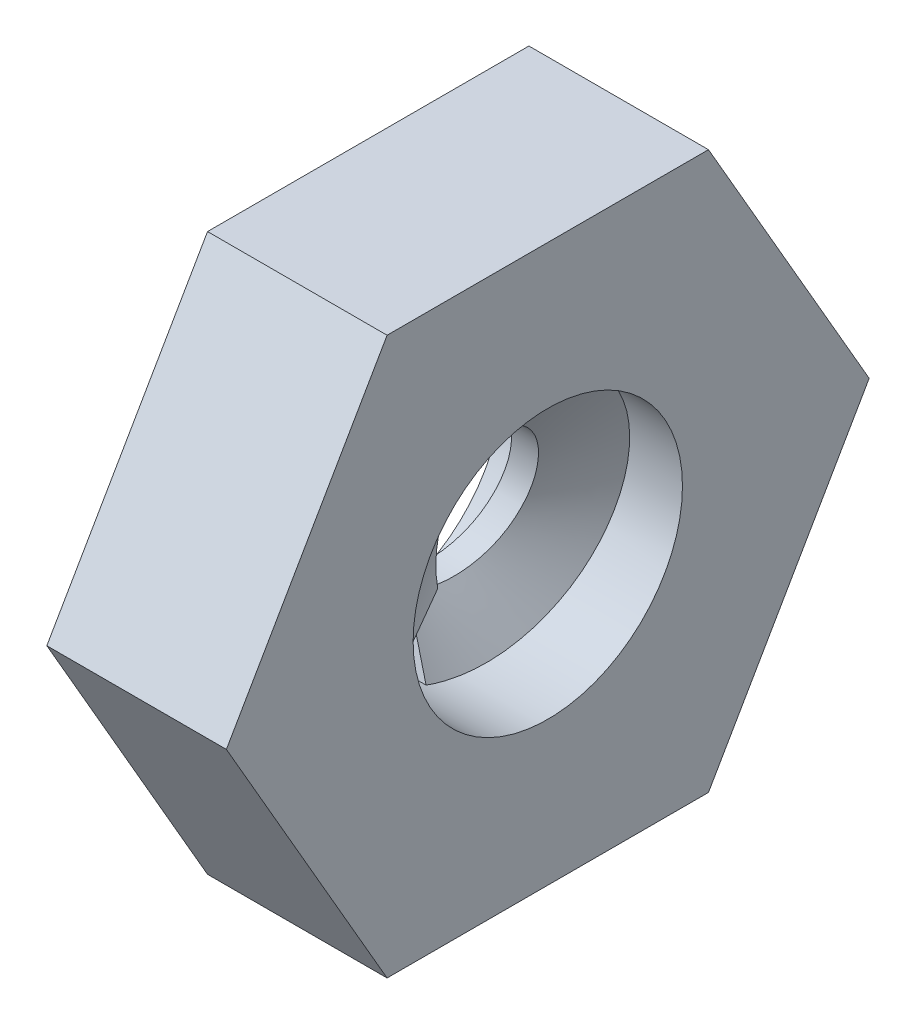
ISO-10303-21;
HEADER;
FILE_DESCRIPTION(('STEP AP214'),'2;1');
FILE_NAME('part.step','',(''),(''),'','','');
FILE_SCHEMA(('AUTOMOTIVE_DESIGN { 1 0 10303 214 1 1 1 1 }'));
ENDSEC;
DATA;
#1=APPLICATION_CONTEXT('core data for automotive mechanical design processes');
#2=APPLICATION_PROTOCOL_DEFINITION('international standard','automotive_design',2000,#1);
#3=PRODUCT_CONTEXT('',#1,'mechanical');
#4=PRODUCT('Part','Part','',(#3));
#5=PRODUCT_RELATED_PRODUCT_CATEGORY('part','',(#4));
#6=PRODUCT_DEFINITION_FORMATION('','',#4);
#7=PRODUCT_DEFINITION_CONTEXT('part definition',#1,'design');
#8=PRODUCT_DEFINITION('design','',#6,#7);
#9=PRODUCT_DEFINITION_SHAPE('','',#8);
#10=(LENGTH_UNIT() NAMED_UNIT(*) SI_UNIT(.MILLI.,.METRE.));
#11=(NAMED_UNIT(*) PLANE_ANGLE_UNIT() SI_UNIT($,.RADIAN.));
#12=(NAMED_UNIT(*) SI_UNIT($,.STERADIAN.) SOLID_ANGLE_UNIT());
#13=UNCERTAINTY_MEASURE_WITH_UNIT(LENGTH_MEASURE(1.E-05),#10,'distance_accuracy_value','');
#14=(GEOMETRIC_REPRESENTATION_CONTEXT(3) GLOBAL_UNCERTAINTY_ASSIGNED_CONTEXT((#13)) GLOBAL_UNIT_ASSIGNED_CONTEXT((#10,
#11,#12)) REPRESENTATION_CONTEXT('',''));
#15=CARTESIAN_POINT('',(0.,0.,0.));
#16=DIRECTION('',(0.,0.,1.));
#17=DIRECTION('',(1.,0.,0.));
#18=AXIS2_PLACEMENT_3D('',#15,#16,#17);
#19=CARTESIAN_POINT('',(5.,0.,0.));
#20=DIRECTION('',(1.,0.,0.));
#21=DIRECTION('',(0.,0.,-1.));
#22=AXIS2_PLACEMENT_3D('',#19,#20,#21);
#23=PLANE('',#22);
#24=DIRECTION('',(0.,-0.866025403784439,0.5));
#25=VECTOR('',#24,1.);
#26=CARTESIAN_POINT('',(5.,7.75,4.4744645862196));
#27=LINE('',#26,#25);
#28=CARTESIAN_POINT('',(5.,7.75,4.4744645862196));
#29=VERTEX_POINT('',#28);
#30=CARTESIAN_POINT('',(5.,0.,8.9489291724392));
#31=VERTEX_POINT('',#30);
#32=EDGE_CURVE('E279',#29,#31,#27,.T.);
#33=ORIENTED_EDGE('',*,*,#32,.T.);
#34=DIRECTION('',(0.,-0.866025403784439,-0.5));
#35=VECTOR('',#34,1.);
#36=CARTESIAN_POINT('',(5.,0.,8.9489291724392));
#37=LINE('',#36,#35);
#38=CARTESIAN_POINT('',(5.,-7.75,4.4744645862196));
#39=VERTEX_POINT('',#38);
#40=EDGE_CURVE('E288',#31,#39,#37,.T.);
#41=ORIENTED_EDGE('',*,*,#40,.T.);
#42=DIRECTION('',(0.,0.,-1.));
#43=VECTOR('',#42,1.);
#44=CARTESIAN_POINT('',(5.,-7.75,4.4744645862196));
#45=LINE('',#44,#43);
#46=CARTESIAN_POINT('',(5.,-7.75,-4.4744645862196));
#47=VERTEX_POINT('',#46);
#48=EDGE_CURVE('E292',#39,#47,#45,.T.);
#49=ORIENTED_EDGE('',*,*,#48,.T.);
#50=DIRECTION('',(0.,0.866025403784439,-0.5));
#51=VECTOR('',#50,1.);
#52=CARTESIAN_POINT('',(5.,-7.75,-4.4744645862196));
#53=LINE('',#52,#51);
#54=CARTESIAN_POINT('',(5.,0.,-8.9489291724392));
#55=VERTEX_POINT('',#54);
#56=EDGE_CURVE('E295',#47,#55,#53,.T.);
#57=ORIENTED_EDGE('',*,*,#56,.T.);
#58=DIRECTION('',(0.,0.866025403784438,0.5));
#59=VECTOR('',#58,1.);
#60=CARTESIAN_POINT('',(5.,0.,-8.9489291724392));
#61=LINE('',#60,#59);
#62=CARTESIAN_POINT('',(5.,7.75,-4.4744645862196));
#63=VERTEX_POINT('',#62);
#64=EDGE_CURVE('E298',#55,#63,#61,.T.);
#65=ORIENTED_EDGE('',*,*,#64,.T.);
#66=DIRECTION('',(0.,0.,1.));
#67=VECTOR('',#66,1.);
#68=CARTESIAN_POINT('',(5.,7.75,-4.4744645862196));
#69=LINE('',#68,#67);
#70=EDGE_CURVE('E301',#63,#29,#69,.T.);
#71=ORIENTED_EDGE('',*,*,#70,.T.);
#72=EDGE_LOOP('',(#33,#41,#49,#57,#65,#71));
#73=FACE_BOUND('',#72,.T.);
#74=CARTESIAN_POINT('',(5.,0.,0.));
#75=DIRECTION('',(1.,0.,0.));
#76=DIRECTION('',(0.,0.,-1.));
#77=AXIS2_PLACEMENT_3D('',#74,#75,#76);
#78=CIRCLE('',#77,3.75);
#79=CARTESIAN_POINT('',(5.,0.,3.75));
#80=VERTEX_POINT('',#79);
#81=EDGE_CURVE('E310',#80,#80,#78,.T.);
#82=ORIENTED_EDGE('',*,*,#81,.F.);
#83=EDGE_LOOP('',(#82));
#84=FACE_BOUND('',#83,.T.);
#85=ADVANCED_FACE('F53',(#73,#84),#23,.T.);
#86=CARTESIAN_POINT('',(0.,0.,0.));
#87=DIRECTION('',(1.,0.,0.));
#88=DIRECTION('',(0.,0.,-1.));
#89=AXIS2_PLACEMENT_3D('',#86,#87,#88);
#90=PLANE('',#89);
#91=DIRECTION('',(0.,-0.866025403784439,0.5));
#92=VECTOR('',#91,1.);
#93=CARTESIAN_POINT('',(0.,7.75,4.4744645862196));
#94=LINE('',#93,#92);
#95=CARTESIAN_POINT('',(0.,7.75,4.4744645862196));
#96=VERTEX_POINT('',#95);
#97=CARTESIAN_POINT('',(0.,0.,8.9489291724392));
#98=VERTEX_POINT('',#97);
#99=EDGE_CURVE('E305',#96,#98,#94,.T.);
#100=ORIENTED_EDGE('',*,*,#99,.F.);
#101=DIRECTION('',(0.,0.,1.));
#102=VECTOR('',#101,1.);
#103=CARTESIAN_POINT('',(0.,7.75,-4.4744645862196));
#104=LINE('',#103,#102);
#105=CARTESIAN_POINT('',(0.,7.75,-4.4744645862196));
#106=VERTEX_POINT('',#105);
#107=EDGE_CURVE('E289',#106,#96,#104,.T.);
#108=ORIENTED_EDGE('',*,*,#107,.F.);
#109=DIRECTION('',(0.,0.866025403784438,0.5));
#110=VECTOR('',#109,1.);
#111=CARTESIAN_POINT('',(0.,0.,-8.9489291724392));
#112=LINE('',#111,#110);
#113=CARTESIAN_POINT('',(0.,0.,-8.9489291724392));
#114=VERTEX_POINT('',#113);
#115=EDGE_CURVE('E319',#114,#106,#112,.T.);
#116=ORIENTED_EDGE('',*,*,#115,.F.);
#117=DIRECTION('',(0.,0.866025403784439,-0.5));
#118=VECTOR('',#117,1.);
#119=CARTESIAN_POINT('',(0.,-7.75,-4.4744645862196));
#120=LINE('',#119,#118);
#121=CARTESIAN_POINT('',(0.,-7.75,-4.4744645862196));
#122=VERTEX_POINT('',#121);
#123=EDGE_CURVE('E316',#122,#114,#120,.T.);
#124=ORIENTED_EDGE('',*,*,#123,.F.);
#125=DIRECTION('',(0.,0.,-1.));
#126=VECTOR('',#125,1.);
#127=CARTESIAN_POINT('',(0.,-7.75,4.4744645862196));
#128=LINE('',#127,#126);
#129=CARTESIAN_POINT('',(0.,-7.75,4.4744645862196));
#130=VERTEX_POINT('',#129);
#131=EDGE_CURVE('E313',#130,#122,#128,.T.);
#132=ORIENTED_EDGE('',*,*,#131,.F.);
#133=DIRECTION('',(0.,-0.866025403784439,-0.5));
#134=VECTOR('',#133,1.);
#135=CARTESIAN_POINT('',(0.,0.,8.9489291724392));
#136=LINE('',#135,#134);
#137=EDGE_CURVE('E309',#98,#130,#136,.T.);
#138=ORIENTED_EDGE('',*,*,#137,.F.);
#139=EDGE_LOOP('',(#100,#108,#116,#124,#132,#138));
#140=FACE_BOUND('',#139,.T.);
#141=CARTESIAN_POINT('',(0.,-3.6035901467687,1.00403722767667));
#142=CARTESIAN_POINT('',(0.,-3.60691659412798,0.997724095163826));
#143=CARTESIAN_POINT('',(0.,-3.61022556250775,0.991401875762249));
#144=CARTESIAN_POINT('',(0.,-3.61680854130825,0.978739263181628));
#145=CARTESIAN_POINT('',(0.,-3.62008255172899,0.972398870002584));
#146=CARTESIAN_POINT('',(0.,-3.62333908317021,0.966049389934805));
#147=B_SPLINE_CURVE_WITH_KNOTS('',3,(#141,#142,#143,#144,#145,#146),.UNSPECIFIED.,.F.,.F.,(4,2,
4),(0.,0.0214074185529152,0.0428148371058308),.UNSPECIFIED.);
#148=CARTESIAN_POINT('',(-0.00132880566526641,-3.61187297212122,1.00840152383406));
#149=VERTEX_POINT('',#148);
#150=CARTESIAN_POINT('',(-2.64876496594296E-05,-3.62341950163316,0.96609063507184));
#151=VERTEX_POINT('',#150);
#152=EDGE_CURVE('E343',#149,#151,#147,.T.);
#153=ORIENTED_EDGE('',*,*,#152,.T.);
#154=CARTESIAN_POINT('',(0.,0.,0.));
#155=DIRECTION('',(1.,0.,0.));
#156=DIRECTION('',(0.,0.,-1.));
#157=AXIS2_PLACEMENT_3D('',#154,#155,#156);
#158=CIRCLE('',#157,3.75);
#159=EDGE_CURVE('E162',#151,#149,#158,.T.);
#160=ORIENTED_EDGE('',*,*,#159,.T.);
#161=EDGE_LOOP('',(#153,#160));
#162=FACE_BOUND('',#161,.T.);
#163=ADVANCED_FACE('F350',(#140,#162),#90,.F.);
#164=CARTESIAN_POINT('',(5.,7.75,4.4744645862196));
#165=DIRECTION('',(0.,-0.5,-0.866025403784439));
#166=DIRECTION('',(0.,0.866025403784439,-0.5));
#167=AXIS2_PLACEMENT_3D('',#164,#165,#166);
#168=PLANE('',#167);
#169=ORIENTED_EDGE('',*,*,#99,.T.);
#170=DIRECTION('',(-1.,0.,0.));
#171=VECTOR('',#170,1.);
#172=CARTESIAN_POINT('',(5.,0.,8.9489291724392));
#173=LINE('',#172,#171);
#174=EDGE_CURVE('E12',#31,#98,#173,.T.);
#175=ORIENTED_EDGE('',*,*,#174,.F.);
#176=ORIENTED_EDGE('',*,*,#32,.F.);
#177=DIRECTION('',(-1.,0.,0.));
#178=VECTOR('',#177,1.);
#179=CARTESIAN_POINT('',(5.,7.75,4.4744645862196));
#180=LINE('',#179,#178);
#181=EDGE_CURVE('E304',#29,#96,#180,.T.);
#182=ORIENTED_EDGE('',*,*,#181,.T.);
#183=EDGE_LOOP('',(#169,#175,#176,#182));
#184=FACE_BOUND('',#183,.T.);
#185=ADVANCED_FACE('F55',(#184),#168,.F.);
#186=CARTESIAN_POINT('',(5.,0.,8.9489291724392));
#187=DIRECTION('',(0.,0.5,-0.866025403784439));
#188=DIRECTION('',(0.,0.866025403784439,0.5));
#189=AXIS2_PLACEMENT_3D('',#186,#187,#188);
#190=PLANE('',#189);
#191=ORIENTED_EDGE('',*,*,#137,.T.);
#192=DIRECTION('',(-1.,0.,0.));
#193=VECTOR('',#192,1.);
#194=CARTESIAN_POINT('',(5.,-7.75,4.4744645862196));
#195=LINE('',#194,#193);
#196=EDGE_CURVE('E70',#39,#130,#195,.T.);
#197=ORIENTED_EDGE('',*,*,#196,.F.);
#198=ORIENTED_EDGE('',*,*,#40,.F.);
#199=ORIENTED_EDGE('',*,*,#174,.T.);
#200=EDGE_LOOP('',(#191,#197,#198,#199));
#201=FACE_BOUND('',#200,.T.);
#202=ADVANCED_FACE('F357',(#201),#190,.F.);
#203=CARTESIAN_POINT('',(5.,-7.75,4.4744645862196));
#204=DIRECTION('',(0.,1.,0.));
#205=DIRECTION('',(0.,0.,1.));
#206=AXIS2_PLACEMENT_3D('',#203,#204,#205);
#207=PLANE('',#206);
#208=ORIENTED_EDGE('',*,*,#131,.T.);
#209=DIRECTION('',(-1.,0.,0.));
#210=VECTOR('',#209,1.);
#211=CARTESIAN_POINT('',(5.,-7.75,-4.4744645862196));
#212=LINE('',#211,#210);
#213=EDGE_CURVE('E335',#47,#122,#212,.T.);
#214=ORIENTED_EDGE('',*,*,#213,.F.);
#215=ORIENTED_EDGE('',*,*,#48,.F.);
#216=ORIENTED_EDGE('',*,*,#196,.T.);
#217=EDGE_LOOP('',(#208,#214,#215,#216));
#218=FACE_BOUND('',#217,.T.);
#219=ADVANCED_FACE('F373',(#218),#207,.F.);
#220=CARTESIAN_POINT('',(5.,-7.75,-4.4744645862196));
#221=DIRECTION('',(0.,0.5,0.866025403784439));
#222=DIRECTION('',(0.,-0.866025403784439,0.5));
#223=AXIS2_PLACEMENT_3D('',#220,#221,#222);
#224=PLANE('',#223);
#225=ORIENTED_EDGE('',*,*,#123,.T.);
#226=DIRECTION('',(-1.,0.,0.));
#227=VECTOR('',#226,1.);
#228=CARTESIAN_POINT('',(5.,0.,-8.9489291724392));
#229=LINE('',#228,#227);
#230=EDGE_CURVE('E331',#55,#114,#229,.T.);
#231=ORIENTED_EDGE('',*,*,#230,.F.);
#232=ORIENTED_EDGE('',*,*,#56,.F.);
#233=ORIENTED_EDGE('',*,*,#213,.T.);
#234=EDGE_LOOP('',(#225,#231,#232,#233));
#235=FACE_BOUND('',#234,.T.);
#236=ADVANCED_FACE('F369',(#235),#224,.F.);
#237=CARTESIAN_POINT('',(5.,0.,-8.9489291724392));
#238=DIRECTION('',(0.,-0.5,0.866025403784438));
#239=DIRECTION('',(0.,-0.866025403784439,-0.5));
#240=AXIS2_PLACEMENT_3D('',#237,#238,#239);
#241=PLANE('',#240);
#242=ORIENTED_EDGE('',*,*,#115,.T.);
#243=DIRECTION('',(-1.,0.,0.));
#244=VECTOR('',#243,1.);
#245=CARTESIAN_POINT('',(5.,7.75,-4.4744645862196));
#246=LINE('',#245,#244);
#247=EDGE_CURVE('E327',#63,#106,#246,.T.);
#248=ORIENTED_EDGE('',*,*,#247,.F.);
#249=ORIENTED_EDGE('',*,*,#64,.F.);
#250=ORIENTED_EDGE('',*,*,#230,.T.);
#251=EDGE_LOOP('',(#242,#248,#249,#250));
#252=FACE_BOUND('',#251,.T.);
#253=ADVANCED_FACE('F365',(#252),#241,.F.);
#254=CARTESIAN_POINT('',(5.,7.75,-4.4744645862196));
#255=DIRECTION('',(0.,-1.,0.));
#256=DIRECTION('',(0.,0.,-1.));
#257=AXIS2_PLACEMENT_3D('',#254,#255,#256);
#258=PLANE('',#257);
#259=ORIENTED_EDGE('',*,*,#107,.T.);
#260=ORIENTED_EDGE('',*,*,#181,.F.);
#261=ORIENTED_EDGE('',*,*,#70,.F.);
#262=ORIENTED_EDGE('',*,*,#247,.T.);
#263=EDGE_LOOP('',(#259,#260,#261,#262));
#264=FACE_BOUND('',#263,.T.);
#265=ADVANCED_FACE('F181',(#264),#258,.F.);
#266=CARTESIAN_POINT('',(5.,0.,0.));
#267=DIRECTION('',(-1.,0.,0.));
#268=DIRECTION('',(0.,0.,1.));
#269=AXIS2_PLACEMENT_3D('',#266,#267,#268);
#270=CYLINDRICAL_SURFACE('',#269,3.75);
#271=DIRECTION('',(0.999999999074594,-1.15685822360469E-05,-4.14364547713794E-05));
#272=VECTOR('',#271,1.);
#273=CARTESIAN_POINT('',(2.38510734826739,-3.61189739906454,1.00831403117208));
#274=LINE('',#273,#272);
#275=CARTESIAN_POINT('',(2.61947706553262,-3.61190010928486,1.00830431941355));
#276=VERTEX_POINT('',#275);
#277=EDGE_CURVE('E148',#149,#276,#274,.T.);
#278=ORIENTED_EDGE('',*,*,#277,.F.);
#279=ORIENTED_EDGE('',*,*,#159,.F.);
#280=CARTESIAN_POINT('',(2.37500000819356,0.,3.75));
#281=CARTESIAN_POINT('',(2.22500000819356,1.2184488608734,3.75));
#282=CARTESIAN_POINT('',(2.07500000819356,2.20419469609677,3.03381372890605));
#283=CARTESIAN_POINT('',(1.92500000819356,3.18994053132015,2.31762745781211));
#284=CARTESIAN_POINT('',(1.77500000819356,3.56646193610683,1.15881372890605));
#285=CARTESIAN_POINT('',(1.62500000819356,3.9429833408935,0.));
#286=CARTESIAN_POINT('',(1.47500000819356,3.56646193610683,-1.15881372890605));
#287=CARTESIAN_POINT('',(1.32500000819356,3.18994053132015,-2.31762745781211));
#288=CARTESIAN_POINT('',(1.17500000819356,2.20419469609677,-3.03381372890605));
#289=CARTESIAN_POINT('',(1.02500000819356,1.2184488608734,-3.75));
#290=CARTESIAN_POINT('',(0.875000008193559,0.,-3.75));
#291=CARTESIAN_POINT('',(0.725000008193559,-1.2184488608734,-3.75));
#292=CARTESIAN_POINT('',(0.575000008193559,-2.20419469609677,-3.03381372890605));
#293=CARTESIAN_POINT('',(0.425000008193559,-3.18994053132015,-2.31762745781211));
#294=CARTESIAN_POINT('',(0.275000008193559,-3.56646193610683,-1.15881372890605));
#295=CARTESIAN_POINT('',(0.135622221895999,-3.91632006872559,-0.0820611137984131));
#296=CARTESIAN_POINT('',(-0.00553023296445167,-3.6118729592468,1.00840156994214));
#297=(BOUNDED_CURVE() B_SPLINE_CURVE(2,(#280,#281,#282,#283,#284,#285,#286,#287,#288,#289,#290,
#291,#292,#293,#294,#295,#296),.UNSPECIFIED.,.F.,.F.) B_SPLINE_CURVE_WITH_KNOTS((3,2,2,2,2,2,2,
2,3),(0.,0.1,0.2,0.3,0.4,0.5,0.6,0.7,0.793241692534411),
.UNSPECIFIED.) CURVE() GEOMETRIC_REPRESENTATION_ITEM() RATIONAL_B_SPLINE_CURVE((1.,
0.951056516295154,1.,0.951056516295154,1.,0.951056516295154,1.,0.951056516295154,1.,
0.951056516295154,1.,0.951056516295154,1.,0.951056516295154,1.,0.954364267408298,0.993831593754557)) REPRESENTATION_ITEM(''));
#298=CARTESIAN_POINT('',(2.37500000819356,0.,3.75));
#299=VERTEX_POINT('',#298);
#300=EDGE_CURVE('E78',#299,#151,#297,.T.);
#301=ORIENTED_EDGE('',*,*,#300,.F.);
#302=DIRECTION('',(1.,0.,0.));
#303=VECTOR('',#302,1.);
#304=CARTESIAN_POINT('',(4.53125000204839,0.,3.75));
#305=LINE('',#304,#303);
#306=EDGE_CURVE('E139',#80,#299,#305,.F.);
#307=ORIENTED_EDGE('',*,*,#306,.F.);
#308=ORIENTED_EDGE('',*,*,#81,.T.);
#309=CARTESIAN_POINT('',(5.,0.,3.75));
#310=CARTESIAN_POINT('',(4.98690973444937,0.106335380673806,3.75001096073016));
#311=CARTESIAN_POINT('',(4.97364076251563,0.212646311641988,3.74547759004888));
#312=CARTESIAN_POINT('',(4.94684221143349,0.424461502806205,3.72741299094927));
#313=CARTESIAN_POINT('',(4.93331264841524,0.529965812369671,3.71388231772235));
#314=CARTESIAN_POINT('',(4.90609831067328,0.739344597879505,3.67792741196688));
#315=CARTESIAN_POINT('',(4.89241366022391,0.843220238994126,3.65550987017816));
#316=CARTESIAN_POINT('',(4.86497703287271,1.04868647468564,3.6019476038125));
#317=CARTESIAN_POINT('',(4.85122505632029,1.15027708110613,3.57080292448059));
#318=CARTESIAN_POINT('',(4.82373936613542,1.35052389777914,3.49998164791967));
#319=CARTESIAN_POINT('',(4.81000567177372,1.44917802486685,3.46029915071153));
#320=CARTESIAN_POINT('',(4.78267215178907,1.64277412610695,3.37269667077226));
#321=CARTESIAN_POINT('',(4.76907232670099,1.73771608543162,3.32477665514171));
#322=CARTESIAN_POINT('',(4.74207399790347,1.92320431780753,3.22103588438312));
#323=CARTESIAN_POINT('',(4.7286754576666,2.01375139522287,3.16521658238404));
#324=CARTESIAN_POINT('',(4.70888616174256,2.1457802723977,3.07586628069302));
#325=CARTESIAN_POINT('',(4.70234046645218,2.18916237090465,3.0451423748328));
#326=CARTESIAN_POINT('',(4.68919628907382,2.2745771776421,2.98188253326374));
#327=CARTESIAN_POINT('',(4.68259780638924,2.3166098705946,2.94934657705021));
#328=CARTESIAN_POINT('',(4.66268039022664,2.44056727568739,2.84910869791175));
#329=CARTESIAN_POINT('',(4.64923765050469,2.52036385138784,2.77876827688518));
#330=CARTESIAN_POINT('',(4.62215727684552,2.67366950745333,2.63159376897979));
#331=CARTESIAN_POINT('',(4.60851964205253,2.74717856020092,2.55475965358089));
#332=CARTESIAN_POINT('',(4.58113396392377,2.88741327228896,2.39512669673772));
#333=CARTESIAN_POINT('',(4.56738590546456,2.95413798475668,2.31232702544416));
#334=CARTESIAN_POINT('',(4.53988195594744,3.08031687608944,2.14136296516033));
#335=CARTESIAN_POINT('',(4.52612606488626,3.13977105192479,2.05319857393457));
#336=CARTESIAN_POINT('',(4.49869657070884,3.2510090493396,1.872095007539));
#337=CARTESIAN_POINT('',(4.48502300581387,3.30278953756554,1.77915378084375));
#338=CARTESIAN_POINT('',(4.45787110806395,3.39826110735389,1.58921678374838));
#339=CARTESIAN_POINT('',(4.44439268879151,3.44195587725608,1.49222288686686));
#340=CARTESIAN_POINT('',(4.42437656120891,3.50120728764748,1.34420108464256));
#341=CARTESIAN_POINT('',(4.41773652669152,3.51991304873876,1.29442635988808));
#342=CARTESIAN_POINT('',(4.40456169951887,3.55519277008789,1.19412294703216));
#343=CARTESIAN_POINT('',(4.39802688926921,3.57176709004797,1.14359438775843));
#344=CARTESIAN_POINT('',(4.37828790949483,3.61823959270055,0.991031056540917));
#345=CARTESIAN_POINT('',(4.36494740691571,3.64489284447146,0.88800481921995));
#346=CARTESIAN_POINT('',(4.33803648179415,3.68933833877929,0.680131957241623));
#347=CARTESIAN_POINT('',(4.32446612213961,3.70713296576319,0.575285830309652));
#348=CARTESIAN_POINT('',(4.29717924150062,3.73375724745786,0.364476285908083));
#349=CARTESIAN_POINT('',(4.28346271973554,3.7425868542637,0.258512862471226));
#350=CARTESIAN_POINT('',(4.2559831788331,3.75121963990016,0.0462234629434232));
#351=CARTESIAN_POINT('',(4.24222015904646,3.75102269216385,-0.0601025182102662));
#352=CARTESIAN_POINT('',(4.21474540600931,3.74160507240011,-0.272356775335808));
#353=CARTESIAN_POINT('',(4.2010336725937,3.73238442944731,-0.378285052587971));
#354=CARTESIAN_POINT('',(4.17375079623555,3.7049704212636,-0.589058124989614));
#355=CARTESIAN_POINT('',(4.16017972120136,3.686772910916,-0.693902396738267));
#356=CARTESIAN_POINT('',(4.1400097684114,3.65284890128712,-0.849719978311062));
#357=CARTESIAN_POINT('',(4.13331682375673,3.64043451741516,-0.901423394288688));
#358=CARTESIAN_POINT('',(4.12000529759704,3.61341551047886,-1.00426802166897));
#359=CARTESIAN_POINT('',(4.11338671609484,3.59881088733147,-1.0554092330503));
#360=CARTESIAN_POINT('',(4.1002287153924,3.56743627134316,-1.157033231917));
#361=CARTESIAN_POINT('',(4.0936892959716,3.5506662845366,-1.2075160212368));
#362=CARTESIAN_POINT('',(4.08050104508935,3.51500094896813,-1.30770694017551));
#363=CARTESIAN_POINT('',(4.0738522136887,3.49610560138717,-1.35741507022484));
#364=CARTESIAN_POINT('',(4.05380955853432,3.43627907201298,-1.50525168363462));
#365=CARTESIAN_POINT('',(4.04031663183902,3.39220033062717,-1.60211528658575));
#366=CARTESIAN_POINT('',(4.01315166618895,3.29601642248437,-1.79166677208819));
#367=CARTESIAN_POINT('',(3.99947972002598,3.24391527419482,-1.88435671537015));
#368=CARTESIAN_POINT('',(3.97205226885211,3.13203803025496,-2.06497480527137));
#369=CARTESIAN_POINT('',(3.95829676340943,3.0722618949126,-2.152902927261));
#370=CARTESIAN_POINT('',(3.93079745240658,2.94546072903545,-2.32336945288131));
#371=CARTESIAN_POINT('',(3.91705364688938,2.87843567198615,-2.40590783679609));
#372=CARTESIAN_POINT('',(3.88968002645371,2.73761449192666,-2.56500561617484));
#373=CARTESIAN_POINT('',(3.8760502108839,2.66381840763408,-2.64156504582262));
#374=CARTESIAN_POINT('',(3.84897814576709,2.50992068719704,-2.78820693633261));
#375=CARTESIAN_POINT('',(3.835536002298,2.42981564241165,-2.85828585079347));
#376=CARTESIAN_POINT('',(3.81563395620823,2.30540588598415,-2.95811321096136));
#377=CARTESIAN_POINT('',(3.80904274301432,2.26322228949081,-2.99051050569861));
#378=CARTESIAN_POINT('',(3.79589305722161,2.17751239627649,-3.05348448525313));
#379=CARTESIAN_POINT('',(3.78933458462655,2.13398609940274,-3.08406116986324));
#380=CARTESIAN_POINT('',(3.76950987686702,2.00153430981367,-3.17295833337534));
#381=CARTESIAN_POINT('',(3.75609140574859,1.91071677234464,-3.22846127942784));
#382=CARTESIAN_POINT('',(3.72905894209396,1.72472956846113,-3.33153337784604));
#383=CARTESIAN_POINT('',(3.7154449493636,1.62955989772433,-3.37910252233206));
#384=CARTESIAN_POINT('',(3.68809493723672,1.43558901233742,-3.46595862886026));
#385=CARTESIAN_POINT('',(3.67435898721405,1.33678977307549,-3.50525001987824));
#386=CARTESIAN_POINT('',(3.64686395281717,1.13621546571764,-3.57530399015147));
#387=CARTESIAN_POINT('',(3.63310486841146,1.03444039356849,-3.60606655778951));
#388=CARTESIAN_POINT('',(3.60565758720569,0.828640152330517,-3.65884437625001));
#389=CARTESIAN_POINT('',(3.59196939107793,0.724614961949703,-3.68085954426107));
#390=CARTESIAN_POINT('',(3.56476690457628,0.515034651287356,-3.71598227076462));
#391=CARTESIAN_POINT('',(3.55125261349298,0.40947953725058,-3.72908986560509));
#392=CARTESIAN_POINT('',(3.53116526796383,0.2505802791374,-3.74199666236927));
#393=CARTESIAN_POINT('',(3.52449798021586,0.197501673240151,-3.7451730937084));
#394=CARTESIAN_POINT('',(3.51127072101403,0.0912405963348436,-3.74926670536613));
#395=CARTESIAN_POINT('',(3.50471074962878,0.0380581252604016,-3.75018388424027));
#396=CARTESIAN_POINT('',(3.49156449965981,-0.0682944433802776,-3.7497551665213));
#397=CARTESIAN_POINT('',(3.48497822107476,-0.121464540945885,-3.74840926981306));
#398=CARTESIAN_POINT('',(3.47171370597271,-0.227684550241468,-3.74345931634272));
#399=CARTESIAN_POINT('',(3.46503546949397,-0.280734462021432,-3.73985526052001));
#400=CARTESIAN_POINT('',(3.44490927473455,-0.439566309406804,-3.72566446001436));
#401=CARTESIAN_POINT('',(3.43136677133826,-0.545055148626658,-3.7116989783057));
#402=CARTESIAN_POINT('',(3.40411952009535,-0.754431040283564,-3.67486555772993));
#403=CARTESIAN_POINT('',(3.39041477150945,-0.858318085417052,-3.65199757828333));
#404=CARTESIAN_POINT('',(3.36294841979586,-1.06372929309746,-3.59753577759468));
#405=CARTESIAN_POINT('',(3.34918684202416,-1.16525439831986,-3.56594550461559));
#406=CARTESIAN_POINT('',(3.32169642154671,-1.36526030993457,-3.49425954278878));
#407=CARTESIAN_POINT('',(3.30796757875096,-1.46374112470619,-3.45416387735426));
#408=CARTESIAN_POINT('',(3.280648150076,-1.65695720586361,-3.36575121959452));
#409=CARTESIAN_POINT('',(3.26705756488198,-1.75169245369355,-3.31743418654624));
#410=CARTESIAN_POINT('',(3.24008156035715,-1.93675198060074,-3.21290865711308));
#411=CARTESIAN_POINT('',(3.22669614087821,-2.02707626286284,-3.15670016642617));
#412=CARTESIAN_POINT('',(3.20692443039038,-2.15875439342024,-3.06677479542997));
#413=CARTESIAN_POINT('',(3.20038363776353,-2.20202075584896,-3.03585740947053));
#414=CARTESIAN_POINT('',(3.18723038537871,-2.28719321291872,-2.9722169861026));
#415=CARTESIAN_POINT('',(3.18061792564363,-2.32909930799398,-2.9394939492705));
#416=CARTESIAN_POINT('',(3.16066689192204,-2.45265849342005,-2.83870739222502));
#417=CARTESIAN_POINT('',(3.14721175525672,-2.53217220337453,-2.76801295387485));
#418=CARTESIAN_POINT('',(3.1201074457981,-2.68488154173246,-2.6201546586507));
#419=CARTESIAN_POINT('',(3.10645827289842,-2.7580771666721,-2.54299079822998));
#420=CARTESIAN_POINT('',(3.07905731809822,-2.89764774693167,-2.38273510788376));
#421=CARTESIAN_POINT('',(3.06530553567953,-2.96402266778313,-2.29964324800465));
#422=CARTESIAN_POINT('',(3.03780143024885,-3.08946532392158,-2.12814210528009));
#423=CARTESIAN_POINT('',(3.02404910791531,-3.148534542228,-2.03973390705675));
#424=CARTESIAN_POINT('',(2.9966382891312,-3.25896026008688,-1.85821559990395));
#425=CARTESIAN_POINT('',(2.98297979246026,-3.31031677776037,-1.7651055020223));
#426=CARTESIAN_POINT('',(2.95585339781543,-3.40495662106928,-1.57482012268212));
#427=CARTESIAN_POINT('',(2.94238551077888,-3.44823948515368,-1.47764460920228));
#428=CARTESIAN_POINT('',(2.92239678688441,-3.50685767989367,-1.329389533874));
#429=CARTESIAN_POINT('',(2.91576871590859,-3.52534766215355,-1.27955054168599));
#430=CARTESIAN_POINT('',(2.90260644817319,-3.56019646789987,-1.17912072167124));
#431=CARTESIAN_POINT('',(2.89607225148321,-3.57655528980655,-1.12852989328722));
#432=CARTESIAN_POINT('',(2.87632308444637,-3.62238227075166,-0.975780115382031));
#433=CARTESIAN_POINT('',(2.86296161037065,-3.64860072019424,-0.872644441957628));
#434=CARTESIAN_POINT('',(2.83601761892405,-3.69217709760068,-0.664554644410586));
#435=CARTESIAN_POINT('',(2.82243508784551,-3.70953447391592,-0.559600407493213));
#436=CARTESIAN_POINT('',(2.79513191007519,-3.73526725872674,-0.348654604534306));
#437=CARTESIAN_POINT('',(2.78141132458587,-3.74364648441813,-0.242663498691237));
#438=CARTESIAN_POINT('',(2.75393376660758,-3.75138123415327,-0.0303923468992673));
#439=CARTESIAN_POINT('',(2.7401768035733,-3.7507389090192,0.0758876241405507));
#440=CARTESIAN_POINT('',(2.70836348204815,-3.73879205175015,0.321660767604783));
#441=CARTESIAN_POINT('',(2.69032604137777,-3.72417353217362,0.46100717141794));
#442=CARTESIAN_POINT('',(2.65459589800687,-3.67952085708832,0.737036733923012));
#443=CARTESIAN_POINT('',(2.6369027261616,-3.64950946608884,0.873723516955323));
#444=CARTESIAN_POINT('',(2.61948226637262,-3.61189993493707,1.0083049439538));
#445=B_SPLINE_CURVE_WITH_KNOTS('',3,(#309,#310,#311,#312,#313,#314,#315,#316,#317,#318,#319,
#320,#321,#322,#323,#324,#325,#326,#327,#328,#329,#330,#331,#332,#333,#334,#335,#336,#337,#338,
#339,#340,#341,#342,#343,#344,#345,#346,#347,#348,#349,#350,#351,#352,#353,#354,#355,#356,#357,
#358,#359,#360,#361,#362,#363,#364,#365,#366,#367,#368,#369,#370,#371,#372,#373,#374,#375,#376,
#377,#378,#379,#380,#381,#382,#383,#384,#385,#386,#387,#388,#389,#390,#391,#392,#393,#394,#395,
#396,#397,#398,#399,#400,#401,#402,#403,#404,#405,#406,#407,#408,#409,#410,#411,#412,#413,#414,
#415,#416,#417,#418,#419,#420,#421,#422,#423,#424,#425,#426,#427,#428,#429,#430,#431,#432,#433,
#434,#435,#436,#437,#438,#439,#440,#441,#442,#443,#444),.UNSPECIFIED.,.F.,.F.,(4,2,2,2,2,2,2,2,
2,2,2,2,2,2,2,2,2,2,2,2,2,2,2,2,2,2,2,2,2,2,2,2,2,2,2,2,2,2,2,2,2,2,2,2,2,2,2,2,2,2,2,2,2,2,2,2,
2,2,2,2,2,2,2,2,2,2,2,4),(0.,0.321314773127185,0.642609720906682,0.963663230364046,
1.2847150753802,1.60598949696476,1.92726520170172,2.24848188216686,2.40912452872795,
2.56976899344752,2.89101231630947,3.21225705013483,3.5335465578853,3.8548361995193,
4.17626499880962,4.49754681340106,4.65826518598296,4.81895640002162,5.14029402376764,
5.46154510729033,5.78279790742162,6.10405521203971,6.42531148156027,6.74671623193904,
6.9074545125672,7.06819279929153,7.22893063808672,7.38966838756891,7.71107168629816,
8.0323145129634,8.35355900103814,8.67480466417339,8.99604849049796,9.31746708686294,
9.47821251712884,9.63895796568491,9.96037494139497,10.2817922363272,10.6030371191181,
10.9242824394784,11.2455308009871,11.5667778516108,11.7275083730232,11.8882389971979,
12.0489696295482,12.2097001950351,12.5310866254462,12.8524745208227,13.1737318664937,
13.4949883278354,13.8162463805094,14.1375042012223,14.2981981450226,14.4588920375273,
14.7802078805559,15.1015238997411,15.4228415426195,15.7440938522674,16.0653454071199,
16.3866153215131,16.5472838271333,16.7079524518508,17.0292915434295,17.3506506376256,
17.6718730468864,17.993018875018,18.4159245404597,18.8382065666274),.UNSPECIFIED.);
#446=EDGE_CURVE('E156',#80,#276,#445,.T.);
#447=ORIENTED_EDGE('',*,*,#446,.T.);
#448=EDGE_LOOP('',(#278,#279,#301,#307,#308,#447));
#449=FACE_BOUND('',#448,.T.);
#450=ADVANCED_FACE('F160',(#449),#270,.F.);
#451=CARTESIAN_POINT('',(4.53125000204839,0.,2.9381011875));
#452=DIRECTION('',(0.,-1.,0.));
#453=DIRECTION('',(0.,0.,-1.));
#454=AXIS2_PLACEMENT_3D('',#451,#452,#453);
#455=PLANE('',#454);
#456=CARTESIAN_POINT('',(4.06250000409678,0.,2.126202375));
#457=CARTESIAN_POINT('',(5.,0.,3.75));
#458=(BOUNDED_CURVE() B_SPLINE_CURVE(1,(#456,#457),.UNSPECIFIED.,.F.,
.F.) B_SPLINE_CURVE_WITH_KNOTS((2,2),(0.,1.),
.UNSPECIFIED.) CURVE() GEOMETRIC_REPRESENTATION_ITEM() RATIONAL_B_SPLINE_CURVE((1.,1.)) REPRESENTATION_ITEM(''));
#459=CARTESIAN_POINT('',(4.06250000409678,0.,2.126202375));
#460=VERTEX_POINT('',#459);
#461=EDGE_CURVE('E144',#460,#80,#458,.T.);
#462=ORIENTED_EDGE('',*,*,#461,.T.);
#463=ORIENTED_EDGE('',*,*,#306,.T.);
#464=CARTESIAN_POINT('',(2.37500000819356,0.,3.75));
#465=CARTESIAN_POINT('',(3.31250000409678,0.,2.126202375));
#466=(BOUNDED_CURVE() B_SPLINE_CURVE(1,(#464,#465),.UNSPECIFIED.,.F.,
.F.) B_SPLINE_CURVE_WITH_KNOTS((2,2),(0.,1.),
.UNSPECIFIED.) CURVE() GEOMETRIC_REPRESENTATION_ITEM() RATIONAL_B_SPLINE_CURVE((1.,1.)) REPRESENTATION_ITEM(''));
#467=CARTESIAN_POINT('',(3.31250000409678,0.,2.126202375));
#468=VERTEX_POINT('',#467);
#469=EDGE_CURVE('E141',#299,#468,#466,.T.);
#470=ORIENTED_EDGE('',*,*,#469,.T.);
#471=CARTESIAN_POINT('',(3.31250000409678,0.,2.126202375));
#472=CARTESIAN_POINT('',(4.06250000409678,0.,2.126202375));
#473=(BOUNDED_CURVE() B_SPLINE_CURVE(1,(#471,#472),.UNSPECIFIED.,.F.,
.F.) B_SPLINE_CURVE_WITH_KNOTS((2,2),(0.,1.),
.UNSPECIFIED.) CURVE() GEOMETRIC_REPRESENTATION_ITEM() RATIONAL_B_SPLINE_CURVE((1.,1.)) REPRESENTATION_ITEM(''));
#474=EDGE_CURVE('E240',#468,#460,#473,.T.);
#475=ORIENTED_EDGE('',*,*,#474,.T.);
#476=EDGE_LOOP('',(#462,#463,#470,#475));
#477=FACE_BOUND('',#476,.T.);
#478=ADVANCED_FACE('F140',(#477),#455,.T.);
#479=CARTESIAN_POINT('',(2.38510734826739,-3.22090045472645,0.899152175275502));
#480=DIRECTION('',(-4.30210632013291E-05,-0.268905074967647,-0.96316668277398));
#481=DIRECTION('',(0.,0.9631666836653,-0.268905075216493));
#482=AXIS2_PLACEMENT_3D('',#479,#480,#481);
#483=PLANE('',#482);
#484=CARTESIAN_POINT('',(1.68198235133997,-2.04790149086779,0.57169574351844));
#485=CARTESIAN_POINT('',(2.61948234724319,-3.611900109346,1.00830431919452));
#486=(BOUNDED_CURVE() B_SPLINE_CURVE(1,(#484,#485),.UNSPECIFIED.,.F.,
.F.) B_SPLINE_CURVE_WITH_KNOTS((2,2),(0.,1.),
.UNSPECIFIED.) CURVE() GEOMETRIC_REPRESENTATION_ITEM() RATIONAL_B_SPLINE_CURVE((0.993827928583072,0.993827928583072)) REPRESENTATION_ITEM(''));
#487=CARTESIAN_POINT('',(1.68197296621777,-2.04789001395203,0.571736852397605));
#488=VERTEX_POINT('',#487);
#489=EDGE_CURVE('E234',#276,#488,#486,.F.);
#490=ORIENTED_EDGE('',*,*,#489,.T.);
#491=CARTESIAN_POINT('',(0.931963581095568,-2.04787853703627,0.57177796127677));
#492=CARTESIAN_POINT('',(1.68196358109557,-2.04787853703627,0.57177796127677));
#493=(BOUNDED_CURVE() B_SPLINE_CURVE(1,(#491,#492),.UNSPECIFIED.,.F.,
.F.) B_SPLINE_CURVE_WITH_KNOTS((2,2),(0.,1.),
.UNSPECIFIED.) CURVE() GEOMETRIC_REPRESENTATION_ITEM() RATIONAL_B_SPLINE_CURVE((0.993833393776324,0.993833393776324)) REPRESENTATION_ITEM(''));
#494=CARTESIAN_POINT('',(0.931966672017168,-2.04788231707131,0.571764422367011));
#495=VERTEX_POINT('',#494);
#496=EDGE_CURVE('E239',#488,#495,#493,.F.);
#497=ORIENTED_EDGE('',*,*,#496,.T.);
#498=CARTESIAN_POINT('',(-0.00553023296445167,-3.6118729592468,1.00840156994214));
#499=CARTESIAN_POINT('',(0.931969762938768,-2.04788609710635,0.571750883457253));
#500=(BOUNDED_CURVE() B_SPLINE_CURVE(1,(#498,#499),.UNSPECIFIED.,.F.,
.F.) B_SPLINE_CURVE_WITH_KNOTS((2,2),(0.,1.),
.UNSPECIFIED.) CURVE() GEOMETRIC_REPRESENTATION_ITEM() RATIONAL_B_SPLINE_CURVE((0.993831593754557,0.993831593754557)) REPRESENTATION_ITEM(''));
#501=EDGE_CURVE('E267',#495,#149,#500,.F.);
#502=ORIENTED_EDGE('',*,*,#501,.T.);
#503=ORIENTED_EDGE('',*,*,#277,.T.);
#504=EDGE_LOOP('',(#490,#497,#502,#503));
#505=FACE_BOUND('',#504,.T.);
#506=ADVANCED_FACE('F182',(#505),#483,.F.);
#507=CARTESIAN_POINT('',(4.06250000409678,0.,2.126202375));
#508=CARTESIAN_POINT('',(3.91250000409678,0.690845029814684,2.126202375));
#509=CARTESIAN_POINT('',(3.76250000409678,1.24975039941423,1.72013385485537));
#510=CARTESIAN_POINT('',(3.61250000409678,1.80865576901378,1.31406533471075));
#511=CARTESIAN_POINT('',(3.46250000409678,2.02213862370598,0.657032667355375));
#512=CARTESIAN_POINT('',(3.31250000409678,2.23562147839819,0.));
#513=CARTESIAN_POINT('',(3.16250000409678,2.02213862370598,-0.657032667355374));
#514=CARTESIAN_POINT('',(3.01250000409678,1.80865576901378,-1.31406533471075));
#515=CARTESIAN_POINT('',(2.86250000409678,1.24975039941423,-1.72013385485537));
#516=CARTESIAN_POINT('',(2.71250000409678,0.690845029814684,-2.126202375));
#517=CARTESIAN_POINT('',(2.56250000409678,0.,-2.126202375));
#518=CARTESIAN_POINT('',(2.41250000409678,-0.690845029814684,-2.126202375));
#519=CARTESIAN_POINT('',(2.26250000409678,-1.24975039941423,-1.72013385485537));
#520=CARTESIAN_POINT('',(2.11250000409678,-1.80865576901378,-1.31406533471075));
#521=CARTESIAN_POINT('',(1.96250000409678,-2.02213862370598,-0.657032667355375));
#522=CARTESIAN_POINT('',(1.82312899931486,-2.22049409012042,-0.0465573138629406));
#523=CARTESIAN_POINT('',(1.68198235133997,-2.04790149086779,0.57169574351844));
#524=CARTESIAN_POINT('',(1.67045080131956,-2.03380083583992,0.622206443976125));
#525=CARTESIAN_POINT('',(1.65891925129915,-2.01970018081205,0.672717144433811));
#526=CARTESIAN_POINT('',(5.,0.,3.75));
#527=CARTESIAN_POINT('',(4.85,1.2184488608734,3.75));
#528=CARTESIAN_POINT('',(4.7,2.20419469609677,3.03381372890605));
#529=CARTESIAN_POINT('',(4.55,3.18994053132015,2.31762745781211));
#530=CARTESIAN_POINT('',(4.4,3.56646193610683,1.15881372890605));
#531=CARTESIAN_POINT('',(4.25,3.9429833408935,0.));
#532=CARTESIAN_POINT('',(4.1,3.56646193610683,-1.15881372890605));
#533=CARTESIAN_POINT('',(3.95,3.18994053132015,-2.31762745781211));
#534=CARTESIAN_POINT('',(3.8,2.20419469609677,-3.03381372890605));
#535=CARTESIAN_POINT('',(3.65,1.2184488608734,-3.75));
#536=CARTESIAN_POINT('',(3.5,0.,-3.75));
#537=CARTESIAN_POINT('',(3.35,-1.2184488608734,-3.75));
#538=CARTESIAN_POINT('',(3.2,-2.20419469609677,-3.03381372890605));
#539=CARTESIAN_POINT('',(3.05,-3.18994053132015,-2.31762745781211));
#540=CARTESIAN_POINT('',(2.9,-3.56646193610683,-1.15881372890605));
#541=CARTESIAN_POINT('',(2.76062899521808,-3.91630304615363,-0.0821135038879012));
#542=CARTESIAN_POINT('',(2.61948234724319,-3.611900109346,1.00830431919452));
#543=CARTESIAN_POINT('',(2.60795079722278,-3.58703067218599,1.09739044238932));
#544=CARTESIAN_POINT('',(2.59641924720237,-3.56216123502599,1.18647656558412));
#545=(BOUNDED_SURFACE() B_SPLINE_SURFACE(1,2,((#507,#508,#509,#510,#511,#512,#513,#514,#515,
#516,#517,#518,#519,#520,#521,#522,#523,#524,#525),(#526,#527,#528,#529,#530,#531,#532,#533,
#534,#535,#536,#537,#538,#539,#540,#541,#542,#543,#544)),.UNSPECIFIED.,.F.,.F.,
.F.) B_SPLINE_SURFACE_WITH_KNOTS((2,2),(3,2,2,2,2,2,2,2,2,3),(0.,1.),(0.,0.1,0.2,0.3,0.4,0.5,
0.6,0.7,0.793237362827607,0.801169736455883),
.UNSPECIFIED.) GEOMETRIC_REPRESENTATION_ITEM() RATIONAL_B_SPLINE_SURFACE(((1.,0.951056516295154,
1.,0.951056516295154,1.,0.951056516295154,1.,0.951056516295154,1.,0.951056516295154,1.,
0.951056516295154,1.,0.951056516295154,1.,0.954366386517642,0.993827928583072,0.993827928583072,
0.993827928583072),(1.,0.951056516295154,1.,0.951056516295154,1.,0.951056516295154,1.,
0.951056516295154,1.,0.951056516295154,1.,0.951056516295154,1.,0.951056516295154,1.,
0.954366386517642,0.993827928583072,0.993827928583072,0.993827928583072))) REPRESENTATION_ITEM('') SURFACE());
#546=CARTESIAN_POINT('',(4.06250000409678,0.,2.126202375));
#547=CARTESIAN_POINT('',(3.91250000409678,0.690845029814684,2.126202375));
#548=CARTESIAN_POINT('',(3.76250000409678,1.24975039941423,1.72013385485537));
#549=CARTESIAN_POINT('',(3.61250000409678,1.80865576901378,1.31406533471075));
#550=CARTESIAN_POINT('',(3.46250000409678,2.02213862370598,0.657032667355375));
#551=CARTESIAN_POINT('',(3.31250000409678,2.23562147839819,0.));
#552=CARTESIAN_POINT('',(3.16250000409678,2.02213862370598,-0.657032667355374));
#553=CARTESIAN_POINT('',(3.01250000409678,1.80865576901378,-1.31406533471075));
#554=CARTESIAN_POINT('',(2.86250000409678,1.24975039941423,-1.72013385485537));
#555=CARTESIAN_POINT('',(2.71250000409678,0.690845029814684,-2.126202375));
#556=CARTESIAN_POINT('',(2.56250000409678,0.,-2.126202375));
#557=CARTESIAN_POINT('',(2.41250000409678,-0.690845029814684,-2.126202375));
#558=CARTESIAN_POINT('',(2.26250000409678,-1.24975039941423,-1.72013385485537));
#559=CARTESIAN_POINT('',(2.11250000409678,-1.80865576901378,-1.31406533471075));
#560=CARTESIAN_POINT('',(1.96250000409678,-2.02213862370598,-0.657032667355375));
#561=CARTESIAN_POINT('',(1.82312899931486,-2.22049409012042,-0.0465573138629406));
#562=CARTESIAN_POINT('',(1.68198235133997,-2.04790149086779,0.57169574351844));
#563=CARTESIAN_POINT('',(1.67045080131956,-2.03380083583992,0.622206443976125));
#564=CARTESIAN_POINT('',(1.65891925129915,-2.01970018081205,0.672717144433811));
#565=(BOUNDED_CURVE() B_SPLINE_CURVE(2,(#546,#547,#548,#549,#550,#551,#552,#553,#554,#555,#556,
#557,#558,#559,#560,#561,#562,#563,#564),.UNSPECIFIED.,.F.,.F.) B_SPLINE_CURVE_WITH_KNOTS((3,2,
2,2,2,2,2,2,2,3),(0.,0.1,0.2,0.3,0.4,0.5,0.6,0.7,0.793237362827607,0.801169736455883),
.UNSPECIFIED.) CURVE() GEOMETRIC_REPRESENTATION_ITEM() RATIONAL_B_SPLINE_CURVE((1.,
0.951056516295154,1.,0.951056516295154,1.,0.951056516295154,1.,0.951056516295154,1.,
0.951056516295154,1.,0.951056516295154,1.,0.951056516295154,1.,0.954366386517642,
0.993827928583072,0.993827928583072,0.993827928583072)) REPRESENTATION_ITEM(''));
#566=EDGE_CURVE('E230',#460,#488,#565,.T.);
#567=ORIENTED_EDGE('',*,*,#461,.F.);
#568=ORIENTED_EDGE('',*,*,#566,.T.);
#569=ORIENTED_EDGE('',*,*,#489,.F.);
#570=ORIENTED_EDGE('',*,*,#446,.F.);
#571=EDGE_LOOP('',(#567,#568,#569,#570));
#572=FACE_BOUND('',#571,.T.);
#573=ADVANCED_FACE('F196',(#572),#545,.F.);
#574=CARTESIAN_POINT('',(3.31250000409678,0.,2.126202375));
#575=CARTESIAN_POINT('',(3.16250000409678,0.690845029814684,2.126202375));
#576=CARTESIAN_POINT('',(3.01250000409678,1.24975039941423,1.72013385485537));
#577=CARTESIAN_POINT('',(2.86250000409678,1.80865576901378,1.31406533471075));
#578=CARTESIAN_POINT('',(2.71250000409678,2.02213862370598,0.657032667355375));
#579=CARTESIAN_POINT('',(2.56250000409678,2.23562147839819,0.));
#580=CARTESIAN_POINT('',(2.41250000409678,2.02213862370598,-0.657032667355374));
#581=CARTESIAN_POINT('',(2.26250000409678,1.80865576901378,-1.31406533471075));
#582=CARTESIAN_POINT('',(2.11250000409678,1.24975039941423,-1.72013385485537));
#583=CARTESIAN_POINT('',(1.96250000409678,0.690845029814684,-2.126202375));
#584=CARTESIAN_POINT('',(1.81250000409678,0.,-2.126202375));
#585=CARTESIAN_POINT('',(1.66250000409678,-0.690845029814684,-2.126202375));
#586=CARTESIAN_POINT('',(1.51250000409678,-1.24975039941423,-1.72013385485537));
#587=CARTESIAN_POINT('',(1.36250000409678,-1.80865576901378,-1.31406533471075));
#588=CARTESIAN_POINT('',(1.21250000409678,-2.02213862370598,-0.657032667355375));
#589=CARTESIAN_POINT('',(1.07311888753077,-2.22050848140397,-0.0465130220464774));
#590=CARTESIAN_POINT('',(0.931963581095568,-2.04787853703627,0.57177796127677));
#591=CARTESIAN_POINT('',(4.06250000409678,0.,2.126202375));
#592=CARTESIAN_POINT('',(3.91250000409678,0.690845029814684,2.126202375));
#593=CARTESIAN_POINT('',(3.76250000409678,1.24975039941423,1.72013385485537));
#594=CARTESIAN_POINT('',(3.61250000409678,1.80865576901378,1.31406533471075));
#595=CARTESIAN_POINT('',(3.46250000409678,2.02213862370598,0.657032667355375));
#596=CARTESIAN_POINT('',(3.31250000409678,2.23562147839819,0.));
#597=CARTESIAN_POINT('',(3.16250000409678,2.02213862370598,-0.657032667355374));
#598=CARTESIAN_POINT('',(3.01250000409678,1.80865576901378,-1.31406533471075));
#599=CARTESIAN_POINT('',(2.86250000409678,1.24975039941423,-1.72013385485537));
#600=CARTESIAN_POINT('',(2.71250000409678,0.690845029814684,-2.126202375));
#601=CARTESIAN_POINT('',(2.56250000409678,0.,-2.126202375));
#602=CARTESIAN_POINT('',(2.41250000409678,-0.690845029814684,-2.126202375));
#603=CARTESIAN_POINT('',(2.26250000409678,-1.24975039941423,-1.72013385485537));
#604=CARTESIAN_POINT('',(2.11250000409678,-1.80865576901378,-1.31406533471075));
#605=CARTESIAN_POINT('',(1.96250000409678,-2.02213862370598,-0.657032667355375));
#606=CARTESIAN_POINT('',(1.82311888753077,-2.22050848140397,-0.0465130220464774));
#607=CARTESIAN_POINT('',(1.68196358109557,-2.04787853703627,0.57177796127677));
#608=(BOUNDED_SURFACE() B_SPLINE_SURFACE(1,2,((#574,#575,#576,#577,#578,#579,#580,#581,#582,
#583,#584,#585,#586,#587,#588,#589,#590),(#591,#592,#593,#594,#595,#596,#597,#598,#599,#600,
#601,#602,#603,#604,#605,#606,#607)),.UNSPECIFIED.,.F.,.F.,.F.) B_SPLINE_SURFACE_WITH_KNOTS((2,
2),(3,2,2,2,2,2,2,2,3),(0.,1.),(0.,0.1,0.2,0.3,0.4,0.5,0.6,0.7,0.793243818760905),
.UNSPECIFIED.) GEOMETRIC_REPRESENTATION_ITEM() RATIONAL_B_SPLINE_SURFACE(((1.,0.951056516295154,
1.,0.951056516295154,1.,0.951056516295154,1.,0.951056516295154,1.,0.951056516295154,1.,
0.951056516295154,1.,0.951056516295154,1.,0.95436322675898,0.993833393776324),(1.,
0.951056516295154,1.,0.951056516295154,1.,0.951056516295154,1.,0.951056516295154,1.,
0.951056516295154,1.,0.951056516295154,1.,0.951056516295154,1.,0.95436322675898,0.993833393776324))) REPRESENTATION_ITEM('') SURFACE());
#609=CARTESIAN_POINT('',(3.31250000409678,0.,2.126202375));
#610=CARTESIAN_POINT('',(3.16250000409678,0.690845029814684,2.126202375));
#611=CARTESIAN_POINT('',(3.01250000409678,1.24975039941423,1.72013385485537));
#612=CARTESIAN_POINT('',(2.86250000409678,1.80865576901378,1.31406533471075));
#613=CARTESIAN_POINT('',(2.71250000409678,2.02213862370598,0.657032667355375));
#614=CARTESIAN_POINT('',(2.56250000409678,2.23562147839819,0.));
#615=CARTESIAN_POINT('',(2.41250000409678,2.02213862370598,-0.657032667355374));
#616=CARTESIAN_POINT('',(2.26250000409678,1.80865576901378,-1.31406533471075));
#617=CARTESIAN_POINT('',(2.11250000409678,1.24975039941423,-1.72013385485537));
#618=CARTESIAN_POINT('',(1.96250000409678,0.690845029814684,-2.126202375));
#619=CARTESIAN_POINT('',(1.81250000409678,0.,-2.126202375));
#620=CARTESIAN_POINT('',(1.66250000409678,-0.690845029814684,-2.126202375));
#621=CARTESIAN_POINT('',(1.51250000409678,-1.24975039941423,-1.72013385485537));
#622=CARTESIAN_POINT('',(1.36250000409678,-1.80865576901378,-1.31406533471075));
#623=CARTESIAN_POINT('',(1.21250000409678,-2.02213862370598,-0.657032667355375));
#624=CARTESIAN_POINT('',(1.07311888753077,-2.22050848140397,-0.0465130220464774));
#625=CARTESIAN_POINT('',(0.931963581095568,-2.04787853703627,0.57177796127677));
#626=(BOUNDED_CURVE() B_SPLINE_CURVE(2,(#609,#610,#611,#612,#613,#614,#615,#616,#617,#618,#619,
#620,#621,#622,#623,#624,#625),.UNSPECIFIED.,.F.,.F.) B_SPLINE_CURVE_WITH_KNOTS((3,2,2,2,2,2,2,
2,3),(0.,0.1,0.2,0.3,0.4,0.5,0.6,0.7,0.793243818760905),
.UNSPECIFIED.) CURVE() GEOMETRIC_REPRESENTATION_ITEM() RATIONAL_B_SPLINE_CURVE((1.,
0.951056516295154,1.,0.951056516295154,1.,0.951056516295154,1.,0.951056516295154,1.,
0.951056516295154,1.,0.951056516295154,1.,0.951056516295154,1.,0.95436322675898,0.993833393776324)) REPRESENTATION_ITEM(''));
#627=EDGE_CURVE('E152',#468,#495,#626,.T.);
#628=ORIENTED_EDGE('',*,*,#474,.F.);
#629=ORIENTED_EDGE('',*,*,#627,.T.);
#630=ORIENTED_EDGE('',*,*,#496,.F.);
#631=ORIENTED_EDGE('',*,*,#566,.F.);
#632=EDGE_LOOP('',(#628,#629,#630,#631));
#633=FACE_BOUND('',#632,.T.);
#634=ADVANCED_FACE('F202',(#633),#608,.F.);
#635=CARTESIAN_POINT('',(2.37500000819356,0.,3.75));
#636=CARTESIAN_POINT('',(2.22500000819356,1.2184488608734,3.75));
#637=CARTESIAN_POINT('',(2.07500000819356,2.20419469609677,3.03381372890605));
#638=CARTESIAN_POINT('',(1.92500000819356,3.18994053132015,2.31762745781211));
#639=CARTESIAN_POINT('',(1.77500000819356,3.56646193610683,1.15881372890605));
#640=CARTESIAN_POINT('',(1.62500000819356,3.9429833408935,0.));
#641=CARTESIAN_POINT('',(1.47500000819356,3.56646193610683,-1.15881372890605));
#642=CARTESIAN_POINT('',(1.32500000819356,3.18994053132015,-2.31762745781211));
#643=CARTESIAN_POINT('',(1.17500000819356,2.20419469609677,-3.03381372890605));
#644=CARTESIAN_POINT('',(1.02500000819356,1.2184488608734,-3.75));
#645=CARTESIAN_POINT('',(0.875000008193559,0.,-3.75));
#646=CARTESIAN_POINT('',(0.725000008193559,-1.2184488608734,-3.75));
#647=CARTESIAN_POINT('',(0.575000008193559,-2.20419469609677,-3.03381372890605));
#648=CARTESIAN_POINT('',(0.425000008193559,-3.18994053132015,-2.31762745781211));
#649=CARTESIAN_POINT('',(0.275000008193559,-3.56646193610683,-1.15881372890605));
#650=CARTESIAN_POINT('',(0.135622221895999,-3.91632006872559,-0.0820611137984131));
#651=CARTESIAN_POINT('',(-0.00553023296445167,-3.6118729592468,1.00840156994214));
#652=CARTESIAN_POINT('',(3.31250000409678,0.,2.126202375));
#653=CARTESIAN_POINT('',(3.16250000409678,0.690845029814684,2.126202375));
#654=CARTESIAN_POINT('',(3.01250000409678,1.24975039941423,1.72013385485537));
#655=CARTESIAN_POINT('',(2.86250000409678,1.80865576901378,1.31406533471075));
#656=CARTESIAN_POINT('',(2.71250000409678,2.02213862370598,0.657032667355375));
#657=CARTESIAN_POINT('',(2.56250000409678,2.23562147839819,0.));
#658=CARTESIAN_POINT('',(2.41250000409678,2.02213862370598,-0.657032667355375));
#659=CARTESIAN_POINT('',(2.26250000409678,1.80865576901378,-1.31406533471075));
#660=CARTESIAN_POINT('',(2.11250000409678,1.24975039941423,-1.72013385485537));
#661=CARTESIAN_POINT('',(1.96250000409678,0.690845029814684,-2.126202375));
#662=CARTESIAN_POINT('',(1.81250000409678,0.,-2.126202375));
#663=CARTESIAN_POINT('',(1.66250000409678,-0.690845029814684,-2.126202375));
#664=CARTESIAN_POINT('',(1.51250000409678,-1.24975039941423,-1.72013385485537));
#665=CARTESIAN_POINT('',(1.36250000409678,-1.80865576901378,-1.31406533471075));
#666=CARTESIAN_POINT('',(1.21250000409678,-2.02213862370598,-0.657032667355375));
#667=CARTESIAN_POINT('',(1.07312221779922,-2.22050374170254,-0.046527609347555));
#668=CARTESIAN_POINT('',(0.931969762938768,-2.04788609710635,0.571750883457253));
#669=(BOUNDED_SURFACE() B_SPLINE_SURFACE(1,2,((#635,#636,#637,#638,#639,#640,#641,#642,#643,
#644,#645,#646,#647,#648,#649,#650,#651),(#652,#653,#654,#655,#656,#657,#658,#659,#660,#661,
#662,#663,#664,#665,#666,#667,#668)),.UNSPECIFIED.,.F.,.F.,.F.) B_SPLINE_SURFACE_WITH_KNOTS((2,
2),(3,2,2,2,2,2,2,2,3),(0.,1.),(0.,0.1,0.2,0.3,0.4,0.5,0.6,0.7,0.793241692534411),
.UNSPECIFIED.) GEOMETRIC_REPRESENTATION_ITEM() RATIONAL_B_SPLINE_SURFACE(((1.,0.951056516295154,
1.,0.951056516295154,1.,0.951056516295154,1.,0.951056516295154,1.,0.951056516295154,1.,
0.951056516295154,1.,0.951056516295154,1.,0.954364267408298,0.993831593754557),(1.,
0.951056516295154,1.,0.951056516295154,1.,0.951056516295154,1.,0.951056516295154,1.,
0.951056516295154,1.,0.951056516295154,1.,0.951056516295154,1.,0.954364267408298,0.993831593754557))) REPRESENTATION_ITEM('') SURFACE());
#670=ORIENTED_EDGE('',*,*,#469,.F.);
#671=ORIENTED_EDGE('',*,*,#300,.T.);
#672=ORIENTED_EDGE('',*,*,#152,.F.);
#673=ORIENTED_EDGE('',*,*,#501,.F.);
#674=ORIENTED_EDGE('',*,*,#627,.F.);
#675=EDGE_LOOP('',(#670,#671,#672,#673,#674));
#676=FACE_BOUND('',#675,.T.);
#677=ADVANCED_FACE('F150',(#676),#669,.F.);
#678=CLOSED_SHELL('',(#85,#163,#185,#202,#219,#236,#253,#265,#450,#478,#506,#573,#634,#677));
#679=MANIFOLD_SOLID_BREP('B2',#678);
#680=ADVANCED_BREP_SHAPE_REPRESENTATION('',(#18,#679),#14);
#681=SHAPE_DEFINITION_REPRESENTATION(#9,#680);
ENDSEC;
END-ISO-10303-21;
